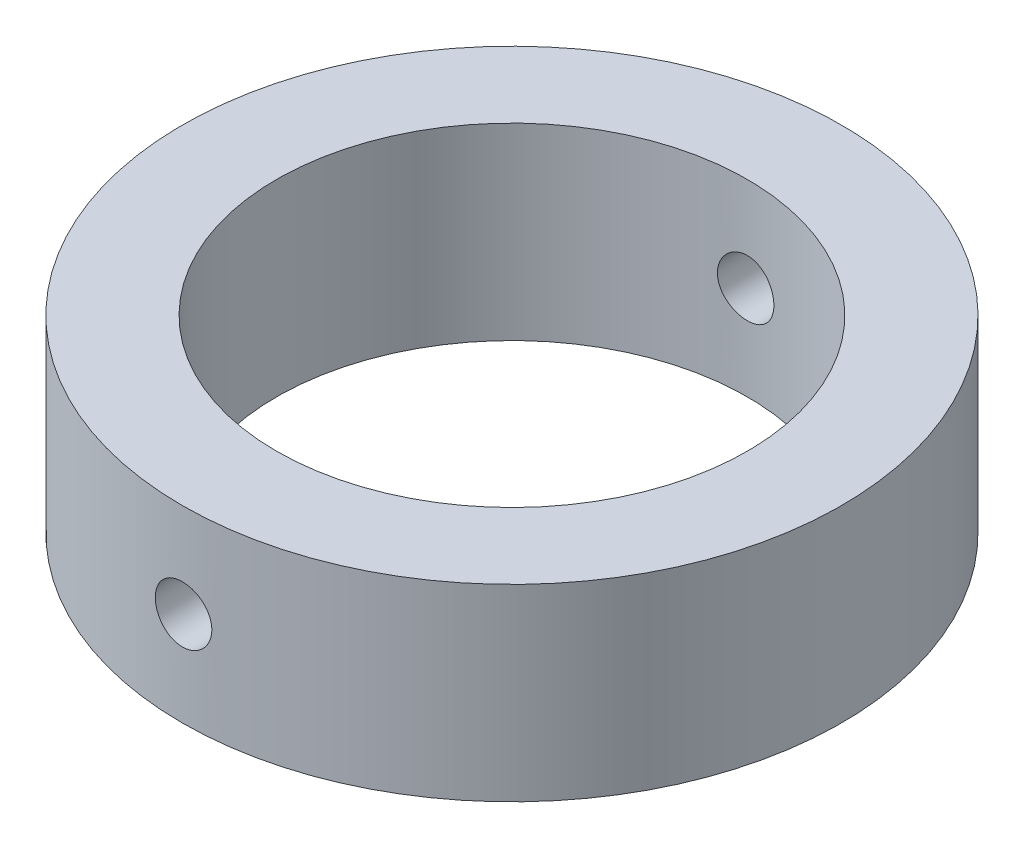
ISO-10303-21;
HEADER;
FILE_DESCRIPTION(('STEP AP214'),'2;1');
FILE_NAME('part.step','',(''),(''),'','','');
FILE_SCHEMA(('AUTOMOTIVE_DESIGN { 1 0 10303 214 1 1 1 1 }'));
ENDSEC;
DATA;
#1=APPLICATION_CONTEXT('core data for automotive mechanical design processes');
#2=APPLICATION_PROTOCOL_DEFINITION('international standard','automotive_design',2000,#1);
#3=PRODUCT_CONTEXT('',#1,'mechanical');
#4=PRODUCT('Part','Part','',(#3));
#5=PRODUCT_RELATED_PRODUCT_CATEGORY('part','',(#4));
#6=PRODUCT_DEFINITION_FORMATION('','',#4);
#7=PRODUCT_DEFINITION_CONTEXT('part definition',#1,'design');
#8=PRODUCT_DEFINITION('design','',#6,#7);
#9=PRODUCT_DEFINITION_SHAPE('','',#8);
#10=(LENGTH_UNIT() NAMED_UNIT(*) SI_UNIT(.MILLI.,.METRE.));
#11=(NAMED_UNIT(*) PLANE_ANGLE_UNIT() SI_UNIT($,.RADIAN.));
#12=(NAMED_UNIT(*) SI_UNIT($,.STERADIAN.) SOLID_ANGLE_UNIT());
#13=UNCERTAINTY_MEASURE_WITH_UNIT(LENGTH_MEASURE(1.E-05),#10,'distance_accuracy_value','');
#14=(GEOMETRIC_REPRESENTATION_CONTEXT(3) GLOBAL_UNCERTAINTY_ASSIGNED_CONTEXT((#13)) GLOBAL_UNIT_ASSIGNED_CONTEXT((#10,
#11,#12)) REPRESENTATION_CONTEXT('',''));
#15=CARTESIAN_POINT('',(0.,0.,0.));
#16=DIRECTION('',(0.,0.,1.));
#17=DIRECTION('',(1.,0.,0.));
#18=AXIS2_PLACEMENT_3D('',#15,#16,#17);
#19=CARTESIAN_POINT('',(0.,20.,0.));
#20=DIRECTION('',(0.,1.,0.));
#21=DIRECTION('',(0.,0.,1.));
#22=AXIS2_PLACEMENT_3D('',#19,#20,#21);
#23=PLANE('',#22);
#24=CARTESIAN_POINT('',(0.,20.,0.));
#25=DIRECTION('',(0.,1.,0.));
#26=DIRECTION('',(0.,0.,1.));
#27=AXIS2_PLACEMENT_3D('',#24,#25,#26);
#28=CIRCLE('',#27,35.);
#29=CARTESIAN_POINT('',(0.,20.,35.));
#30=VERTEX_POINT('',#29);
#31=EDGE_CURVE('E10',#30,#30,#28,.T.);
#32=ORIENTED_EDGE('',*,*,#31,.T.);
#33=EDGE_LOOP('',(#32));
#34=FACE_BOUND('',#33,.T.);
#35=CARTESIAN_POINT('',(0.,20.,0.));
#36=DIRECTION('',(0.,1.,0.));
#37=DIRECTION('',(0.,0.,1.));
#38=AXIS2_PLACEMENT_3D('',#35,#36,#37);
#39=CIRCLE('',#38,25.);
#40=CARTESIAN_POINT('',(0.,20.,25.));
#41=VERTEX_POINT('',#40);
#42=EDGE_CURVE('E56',#41,#41,#39,.T.);
#43=ORIENTED_EDGE('',*,*,#42,.F.);
#44=EDGE_LOOP('',(#43));
#45=FACE_BOUND('',#44,.T.);
#46=ADVANCED_FACE('F37',(#34,#45),#23,.T.);
#47=CARTESIAN_POINT('',(0.,0.,0.));
#48=DIRECTION('',(0.,1.,0.));
#49=DIRECTION('',(0.,0.,1.));
#50=AXIS2_PLACEMENT_3D('',#47,#48,#49);
#51=PLANE('',#50);
#52=CARTESIAN_POINT('',(0.,0.,0.));
#53=DIRECTION('',(0.,1.,0.));
#54=DIRECTION('',(0.,0.,1.));
#55=AXIS2_PLACEMENT_3D('',#52,#53,#54);
#56=CIRCLE('',#55,35.);
#57=CARTESIAN_POINT('',(0.,0.,35.));
#58=VERTEX_POINT('',#57);
#59=EDGE_CURVE('E51',#58,#58,#56,.T.);
#60=ORIENTED_EDGE('',*,*,#59,.F.);
#61=EDGE_LOOP('',(#60));
#62=FACE_BOUND('',#61,.T.);
#63=CARTESIAN_POINT('',(0.,0.,0.));
#64=DIRECTION('',(0.,1.,0.));
#65=DIRECTION('',(0.,0.,1.));
#66=AXIS2_PLACEMENT_3D('',#63,#64,#65);
#67=CIRCLE('',#66,25.);
#68=CARTESIAN_POINT('',(0.,0.,25.));
#69=VERTEX_POINT('',#68);
#70=EDGE_CURVE('E59',#69,#69,#67,.T.);
#71=ORIENTED_EDGE('',*,*,#70,.T.);
#72=EDGE_LOOP('',(#71));
#73=FACE_BOUND('',#72,.T.);
#74=ADVANCED_FACE('F95',(#62,#73),#51,.F.);
#75=CARTESIAN_POINT('',(0.,20.,0.));
#76=DIRECTION('',(0.,-1.,0.));
#77=DIRECTION('',(0.,0.,-1.));
#78=AXIS2_PLACEMENT_3D('',#75,#76,#77);
#79=CYLINDRICAL_SURFACE('',#78,35.);
#80=CARTESIAN_POINT('',(0.,13.,-35.));
#81=CARTESIAN_POINT('',(-0.168180177421425,12.9999926621086,-34.9999983189466));
#82=CARTESIAN_POINT('',(-0.336474410694065,12.9858101377132,-34.9987748870089));
#83=CARTESIAN_POINT('',(-0.668405276387218,12.9294427662291,-34.9940120055983));
#84=CARTESIAN_POINT('',(-0.832036433522409,12.8872263096079,-34.9904699418268));
#85=CARTESIAN_POINT('',(-1.14978580604665,12.7760219308489,-34.9814700099417));
#86=CARTESIAN_POINT('',(-1.30390939390644,12.7070492915307,-34.9760132356579));
#87=CARTESIAN_POINT('',(-1.5983553572425,12.5443180840418,-34.9637955952331));
#88=CARTESIAN_POINT('',(-1.7386806487592,12.4505647683675,-34.9570350055299));
#89=CARTESIAN_POINT('',(-2.00196024172095,12.2406617110507,-34.9429478698077));
#90=CARTESIAN_POINT('',(-2.12487233650439,12.1244591132005,-34.9356200130702));
#91=CARTESIAN_POINT('',(-2.34947428548936,11.8730679106441,-34.9212352148941));
#92=CARTESIAN_POINT('',(-2.45116320107853,11.7378784666713,-34.9141782854488));
#93=CARTESIAN_POINT('',(-2.63057608789142,11.4520942390574,-34.9011203668809));
#94=CARTESIAN_POINT('',(-2.70826279885841,11.3014759820008,-34.895121025662));
#95=CARTESIAN_POINT('',(-2.83722803822897,10.9892731041776,-34.8848727505605));
#96=CARTESIAN_POINT('',(-2.88850705745045,10.8276886872931,-34.8806237841455));
#97=CARTESIAN_POINT('',(-2.96307845769353,10.4985643557107,-34.8743684880487));
#98=CARTESIAN_POINT('',(-2.98643979537529,10.3310401716124,-34.8723566335604));
#99=CARTESIAN_POINT('',(-3.00472573441206,9.99443731566983,-34.8707859372111));
#100=CARTESIAN_POINT('',(-2.99965089755265,9.82535867460139,-34.8712270468893));
#101=CARTESIAN_POINT('',(-2.96126551313284,9.49091935009246,-34.874507414771));
#102=CARTESIAN_POINT('',(-2.92802995365881,9.32554998866099,-34.8773403039272));
#103=CARTESIAN_POINT('',(-2.83438308452453,9.00274549875546,-34.8850750500347));
#104=CARTESIAN_POINT('',(-2.77397149596723,8.84531045172664,-34.8899769282191));
#105=CARTESIAN_POINT('',(-2.62760362876988,8.5426048976093,-34.9013046627491));
#106=CARTESIAN_POINT('',(-2.54161375570937,8.39735071245932,-34.9077325210554));
#107=CARTESIAN_POINT('',(-2.34655446417304,8.12330862382476,-34.9213861292491));
#108=CARTESIAN_POINT('',(-2.23748455081154,7.99452107351525,-34.9286118962437));
#109=CARTESIAN_POINT('',(-1.99894091774494,7.75663207823613,-34.9430754969892));
#110=CARTESIAN_POINT('',(-1.86940237855328,7.64759561833133,-34.9503132942366));
#111=CARTESIAN_POINT('',(-1.59382461581758,7.45280656292255,-34.9639632077666));
#112=CARTESIAN_POINT('',(-1.44778538038973,7.36705398418778,-34.9703753234546));
#113=CARTESIAN_POINT('',(-1.14330913680171,7.2212707481009,-34.9816527329005));
#114=CARTESIAN_POINT('',(-0.984870717201057,7.16124302414623,-34.9865178502383));
#115=CARTESIAN_POINT('',(-0.660113221128349,7.06865924334512,-34.9941511080319));
#116=CARTESIAN_POINT('',(-0.493794317781496,7.03610258328611,-34.9969192945321));
#117=CARTESIAN_POINT('',(-0.158560250833971,6.99946669791016,-35.0000408811528));
#118=CARTESIAN_POINT('',(0.0103450366761299,6.99529772286168,-35.0004018916599));
#119=CARTESIAN_POINT('',(0.346452104482659,7.01532035576532,-34.9986887867208));
#120=CARTESIAN_POINT('',(0.513653901587615,7.03951168360929,-34.9966146953254));
#121=CARTESIAN_POINT('',(0.841351421558966,7.11549382233641,-34.9902695086844));
#122=CARTESIAN_POINT('',(1.00185687270474,7.16724297716301,-34.9860017297263));
#123=CARTESIAN_POINT('',(1.31190702245475,7.29682922006561,-34.9757485102754));
#124=CARTESIAN_POINT('',(1.46145153801856,7.37466674367936,-34.9697630411066));
#125=CARTESIAN_POINT('',(1.7457428816744,7.55444535294469,-34.9567262474856));
#126=CARTESIAN_POINT('',(1.88045202960912,7.65644583152676,-34.9496723123826));
#127=CARTESIAN_POINT('',(2.13086824169311,7.88156921992449,-34.9352996751561));
#128=CARTESIAN_POINT('',(2.24657495644839,8.00469251803617,-34.9279809681673));
#129=CARTESIAN_POINT('',(2.45601016602155,8.26895626973909,-34.9138810732733));
#130=CARTESIAN_POINT('',(2.54968004901865,8.41014326356234,-34.9071013498897));
#131=CARTESIAN_POINT('',(2.71198063229128,8.70629524502194,-34.8948680127784));
#132=CARTESIAN_POINT('',(2.78061159495576,8.8612600882557,-34.8894143851545));
#133=CARTESIAN_POINT('',(2.8907865424564,9.18036221112401,-34.8804590783594));
#134=CARTESIAN_POINT('',(2.93236627395852,9.34448707344406,-34.8769548240937));
#135=CARTESIAN_POINT('',(2.98737479633476,9.67742005737787,-34.872286503041));
#136=CARTESIAN_POINT('',(3.0008041627162,9.84622808317732,-34.871122388412));
#137=CARTESIAN_POINT('',(2.99912392353084,10.1831530647903,-34.8712668950776));
#138=CARTESIAN_POINT('',(2.98410640669543,10.3512704909289,-34.8725675374249));
#139=CARTESIAN_POINT('',(2.92615085557176,10.6825859274482,-34.8774780477604));
#140=CARTESIAN_POINT('',(2.88321277999482,10.8457839305537,-34.8810879191635));
#141=CARTESIAN_POINT('',(2.7706585792072,11.1626330215739,-34.8902080316544));
#142=CARTESIAN_POINT('',(2.70104425727074,11.3162847539864,-34.8957181442861));
#143=CARTESIAN_POINT('',(2.53712384137618,11.6097355757974,-34.9080181097009));
#144=CARTESIAN_POINT('',(2.4428181018962,11.7495348640265,-34.9148079441114));
#145=CARTESIAN_POINT('',(2.23184571903132,12.0117838459397,-34.9289284828144));
#146=CARTESIAN_POINT('',(2.11511080731054,12.1341785330169,-34.9362607952504));
#147=CARTESIAN_POINT('',(1.86271960746937,12.357688026767,-34.9506254222313));
#148=CARTESIAN_POINT('',(1.72705875414518,12.4587976843829,-34.9576576638589));
#149=CARTESIAN_POINT('',(1.44039065385252,12.6370108284413,-34.9706432183249));
#150=CARTESIAN_POINT('',(1.28935405311577,12.7140672103455,-34.9765944046818));
#151=CARTESIAN_POINT('',(0.976537475486436,12.8416267776672,-34.9867226680456));
#152=CARTESIAN_POINT('',(0.814770058056751,12.8921604088507,-34.9909017781752));
#153=CARTESIAN_POINT('',(0.543377751492647,12.9524054943071,-34.9959451685553));
#154=CARTESIAN_POINT('',(0.4354969109927,12.9702296244532,-34.9974587860022));
#155=CARTESIAN_POINT('',(0.218426750644092,12.9940292435666,-34.9994867462511));
#156=CARTESIAN_POINT('',(0.109237434508938,13.0000047661528,-35.0000010918883));
#157=CARTESIAN_POINT('',(0.,13.,-35.));
#158=B_SPLINE_CURVE_WITH_KNOTS('',3,(#80,#81,#82,#83,#84,#85,#86,#87,#88,#89,#90,#91,#92,#93,
#94,#95,#96,#97,#98,#99,#100,#101,#102,#103,#104,#105,#106,#107,#108,#109,#110,#111,#112,#113,
#114,#115,#116,#117,#118,#119,#120,#121,#122,#123,#124,#125,#126,#127,#128,#129,#130,#131,#132,
#133,#134,#135,#136,#137,#138,#139,#140,#141,#142,#143,#144,#145,#146,#147,#148,#149,#150,#151,
#152,#153,#154,#155,#156,#157),.UNSPECIFIED.,.T.,.F.,(4,2,2,2,2,2,2,2,2,2,2,2,2,2,2,2,2,2,2,2,2,
2,2,2,2,2,2,2,2,2,2,2,2,2,2,2,2,2,4),(0.,0.504141688620748,1.0088527873041,1.51327602436422,
2.01759242981481,2.5231110330061,3.0286519884333,3.53497383147415,4.04128626359052,
4.54634550220951,5.05139476290399,5.55510335902216,6.05881712462464,6.56319540924795,
7.06758450992202,7.57360414720597,8.07962414892789,8.58570183661506,9.09176841150507,
9.59623427417642,10.1006951543972,10.6043956535469,11.1081045622491,11.6130646830275,
12.1180340873686,12.6243317573245,13.1306241215114,13.636246082805,14.1418577070399,
14.6458353534655,15.1498137451707,15.6537580747011,16.1576951698375,16.6631911333163,
17.1688092410494,17.6754113983993,18.1814307424438,18.5088849156758,18.8363381597995),.UNSPECIFIED.);
#159=CARTESIAN_POINT('',(0.,13.,-35.));
#160=VERTEX_POINT('',#159);
#161=EDGE_CURVE('E84',#160,#160,#158,.T.);
#162=ORIENTED_EDGE('',*,*,#161,.T.);
#163=EDGE_LOOP('',(#162));
#164=FACE_BOUND('',#163,.T.);
#165=CARTESIAN_POINT('',(3.,10.,34.8711915483254));
#166=CARTESIAN_POINT('',(2.99999266095691,9.83182110220312,34.8711932525099));
#167=CARTESIAN_POINT('',(2.98581034508464,9.6635281444135,34.8724213033618));
#168=CARTESIAN_POINT('',(2.92944387718635,9.33159992889202,34.8772006862277));
#169=CARTESIAN_POINT('',(2.88722811123404,9.16797014744623,34.8807546411484));
#170=CARTESIAN_POINT('',(2.77602575299661,8.85022368351939,34.8897803696251));
#171=CARTESIAN_POINT('',(2.70705447640826,8.69610161691769,34.8952510458163));
#172=CARTESIAN_POINT('',(2.54432647781201,8.40165820131932,34.9074924396004));
#173=CARTESIAN_POINT('',(2.45057500494258,8.2613339381889,34.9142628817837));
#174=CARTESIAN_POINT('',(2.24067380704696,7.99805317899114,34.9283615283204));
#175=CARTESIAN_POINT('',(2.12447081430967,7.87513921650707,34.9356910335478));
#176=CARTESIAN_POINT('',(1.87307803845591,7.65053366426425,34.9500700569052));
#177=CARTESIAN_POINT('',(1.73788742116142,7.54884300739128,34.9571195627167));
#178=CARTESIAN_POINT('',(1.45210217047511,7.36942830362212,34.9701567059702));
#179=CARTESIAN_POINT('',(1.3014842653979,7.29174119609241,34.9761427008053));
#180=CARTESIAN_POINT('',(0.989282152733707,7.16277512639066,34.9863643242021));
#181=CARTESIAN_POINT('',(0.827698147061467,7.11149567813343,34.9905999849818));
#182=CARTESIAN_POINT('',(0.49857505421878,7.03692337559085,34.9968345988916));
#183=CARTESIAN_POINT('',(0.331051705301398,7.01356152909634,34.9988390650836));
#184=CARTESIAN_POINT('',(-0.00554951687182026,6.99527428308786,35.0004041331516));
#185=CARTESIAN_POINT('',(-0.174627359650711,7.00034832725016,34.9999647828389));
#186=CARTESIAN_POINT('',(-0.509070191841329,7.03873246102892,34.9966962646731));
#187=CARTESIAN_POINT('',(-0.674443766007425,7.07196836038356,34.9938733761383));
#188=CARTESIAN_POINT('',(-0.997256506055931,7.16561737123898,34.9861624784117));
#189=CARTESIAN_POINT('',(-1.154695592729,7.22603075399063,34.9812744486083));
#190=CARTESIAN_POINT('',(-1.45740602670417,7.37240232714897,34.9699723253966));
#191=CARTESIAN_POINT('',(-1.6026612561083,7.45839369186082,34.9635562523037));
#192=CARTESIAN_POINT('',(-1.87670479976716,7.6534561621967,34.9499189285463));
#193=CARTESIAN_POINT('',(-2.0054927602542,7.76252776352178,34.9426976605898));
#194=CARTESIAN_POINT('',(-2.24337983249144,8.00107258841206,34.9282339351113));
#195=CARTESIAN_POINT('',(-2.35241430046894,8.13061028823158,34.9209914841214));
#196=CARTESIAN_POINT('',(-2.54719973764136,8.40618566384501,34.9073249949716));
#197=CARTESIAN_POINT('',(-2.63295068598784,8.55222335441313,34.9009009575446));
#198=CARTESIAN_POINT('',(-2.77873275129373,8.85669919114177,34.8895975532274));
#199=CARTESIAN_POINT('',(-2.83876042932541,9.01513899198607,34.8847183928937));
#200=CARTESIAN_POINT('',(-2.93134369450066,9.33989948862507,34.8770612464214));
#201=CARTESIAN_POINT('',(-2.96389989316699,9.50622000890571,34.8742832135113));
#202=CARTESIAN_POINT('',(-3.00053403997774,9.84145480950811,34.8711505281844));
#203=CARTESIAN_POINT('',(-3.00470217287089,10.0103591658262,34.8707882014983));
#204=CARTESIAN_POINT('',(-2.98467818807446,10.3464641685157,34.872507698123));
#205=CARTESIAN_POINT('',(-2.96048635048195,10.5136648316971,34.8745894972945));
#206=CARTESIAN_POINT('',(-2.88450436177439,10.8413568051811,34.8809556846261));
#207=CARTESIAN_POINT('',(-2.8327563709266,11.0018579621147,34.8852367076732));
#208=CARTESIAN_POINT('',(-2.70317389532559,11.3119000388947,34.8955161982866));
#209=CARTESIAN_POINT('',(-2.62533896819065,11.461440772822,34.9015146949777));
#210=CARTESIAN_POINT('',(-2.44556416469073,11.7457295680083,34.914571856145));
#211=CARTESIAN_POINT('',(-2.34356423538402,11.8804395313929,34.9216331455838));
#212=CARTESIAN_POINT('',(-2.11844147546403,12.1308576448824,34.9360114257588));
#213=CARTESIAN_POINT('',(-1.99531826047652,12.2465654491355,34.9433284211461));
#214=CARTESIAN_POINT('',(-1.7310540273121,12.4560029728843,34.9574165642762));
#215=CARTESIAN_POINT('',(-1.58986645530174,12.549674065437,34.9641862252016));
#216=CARTESIAN_POINT('',(-1.2937129987535,12.7119767717214,34.9763954820041));
#217=CARTESIAN_POINT('',(-1.1387472587636,12.7806086481032,34.9818350918327));
#218=CARTESIAN_POINT('',(-0.819645734517392,12.8907842087084,34.9907645239193));
#219=CARTESIAN_POINT('',(-0.655522504793544,12.932364035361,34.9942569467868));
#220=CARTESIAN_POINT('',(-0.322592960793772,12.9873733013822,34.998909077746));
#221=CARTESIAN_POINT('',(-0.153786740881575,13.0008033075618,35.000068832807));
#222=CARTESIAN_POINT('',(0.183139370810557,12.9991249178628,34.9999250150549));
#223=CARTESIAN_POINT('',(0.351259728396027,12.9841078420171,34.9986293246391));
#224=CARTESIAN_POINT('',(0.682581136937832,12.9261521408573,34.9937357808951));
#225=CARTESIAN_POINT('',(0.845782181536318,12.8832134794582,34.9901379245917));
#226=CARTESIAN_POINT('',(1.16263730873111,12.7706569781232,34.9810436514562));
#227=CARTESIAN_POINT('',(1.31629202900732,12.701040922428,34.9755473615978));
#228=CARTESIAN_POINT('',(1.60974810184892,12.5371161153677,34.9632708237673));
#229=CARTESIAN_POINT('',(1.74954965509232,12.4428077217697,34.9564905943986));
#230=CARTESIAN_POINT('',(2.01179846018098,12.2318324384591,34.9423810754166));
#231=CARTESIAN_POINT('',(2.13419119122391,12.1150978861273,34.9350501661676));
#232=CARTESIAN_POINT('',(2.35769690654864,11.8627082072799,34.9206793149367));
#233=CARTESIAN_POINT('',(2.45880473667584,11.7270485112192,34.9136394437606));
#234=CARTESIAN_POINT('',(2.63701593547982,11.4403813349937,34.9006328206687));
#235=CARTESIAN_POINT('',(2.71407186567635,11.2893442935208,34.8946681991704));
#236=CARTESIAN_POINT('',(2.84163046603466,10.9765267772395,34.8845133075443));
#237=CARTESIAN_POINT('',(2.89216358839389,10.8147588646337,34.8803210036088));
#238=CARTESIAN_POINT('',(2.95240722581038,10.5433679219208,34.8752608485375));
#239=CARTESIAN_POINT('',(2.97023070444527,10.4354890428811,34.8737419022807));
#240=CARTESIAN_POINT('',(2.9940294579401,10.218422813093,34.871706700165));
#241=CARTESIAN_POINT('',(3.00000476685127,10.109235466106,34.8711904414244));
#242=CARTESIAN_POINT('',(3.,10.,34.8711915483254));
#243=B_SPLINE_CURVE_WITH_KNOTS('',3,(#165,#166,#167,#168,#169,#170,#171,#172,#173,#174,#175,
#176,#177,#178,#179,#180,#181,#182,#183,#184,#185,#186,#187,#188,#189,#190,#191,#192,#193,#194,
#195,#196,#197,#198,#199,#200,#201,#202,#203,#204,#205,#206,#207,#208,#209,#210,#211,#212,#213,
#214,#215,#216,#217,#218,#219,#220,#221,#222,#223,#224,#225,#226,#227,#228,#229,#230,#231,#232,
#233,#234,#235,#236,#237,#238,#239,#240,#241,#242),.UNSPECIFIED.,.T.,.F.,(4,2,2,2,2,2,2,2,2,2,2,
2,2,2,2,2,2,2,2,2,2,2,2,2,2,2,2,2,2,2,2,2,2,2,2,2,2,2,4),(0.,0.504137845154904,1.0088451851254,
1.51326404003696,2.01757613044269,2.52309976273197,3.0286456110007,3.53496561920689,
4.04127630725863,4.54633315507159,5.0513801219166,5.55510070289603,6.05882631148133,
6.56320811562686,7.06760075362891,7.57361533214636,8.07963036375613,8.58571302310648,
9.09178441661877,9.5962473420388,10.1007052851759,10.6043936277359,11.1080905122643,
11.6130525231886,12.1180237237333,12.6243235404852,13.1306180462274,13.6362347291713,
14.1418412311696,14.6458273992463,15.1498142186598,15.6537673362459,16.1577131524622,
16.6632040203355,17.1688171527569,17.6754213142688,18.1814425380561,18.5088908177617,
18.836338156391),.UNSPECIFIED.);
#244=CARTESIAN_POINT('',(3.,10.,34.8711915483254));
#245=VERTEX_POINT('',#244);
#246=EDGE_CURVE('E79',#245,#245,#243,.T.);
#247=ORIENTED_EDGE('',*,*,#246,.T.);
#248=EDGE_LOOP('',(#247));
#249=FACE_BOUND('',#248,.T.);
#250=ORIENTED_EDGE('',*,*,#31,.F.);
#251=EDGE_LOOP('',(#250));
#252=FACE_BOUND('',#251,.T.);
#253=ORIENTED_EDGE('',*,*,#59,.T.);
#254=EDGE_LOOP('',(#253));
#255=FACE_BOUND('',#254,.T.);
#256=ADVANCED_FACE('F39',(#164,#249,#252,#255),#79,.T.);
#257=CARTESIAN_POINT('',(0.,20.,0.));
#258=DIRECTION('',(0.,-1.,0.));
#259=DIRECTION('',(0.,0.,-1.));
#260=AXIS2_PLACEMENT_3D('',#257,#258,#259);
#261=CYLINDRICAL_SURFACE('',#260,25.);
#262=CARTESIAN_POINT('',(0.,13.,-25.));
#263=CARTESIAN_POINT('',(-0.167864047107699,12.9999928360586,-24.9999977357459));
#264=CARTESIAN_POINT('',(-0.335834317331191,12.9858633413073,-24.9982914200408));
#265=CARTESIAN_POINT('',(-0.66710457130825,12.9297189358446,-24.991648705422));
#266=CARTESIAN_POINT('',(-0.830399429590069,12.8876745587494,-24.9867088933728));
#267=CARTESIAN_POINT('',(-1.14747479534053,12.776953723474,-24.9741559265426));
#268=CARTESIAN_POINT('',(-1.30126148759225,12.7082947931758,-24.9665445315309));
#269=CARTESIAN_POINT('',(-1.595099157832,12.5463312649167,-24.9494959264345));
#270=CARTESIAN_POINT('',(-1.73515256713516,12.4530310402467,-24.9400590404141));
#271=CARTESIAN_POINT('',(-1.99829131534451,12.2439251380248,-24.920360105442));
#272=CARTESIAN_POINT('',(-2.1212966913072,12.1280191598881,-24.9100945030904));
#273=CARTESIAN_POINT('',(-2.34615931038342,11.8772070351121,-24.8899239397152));
#274=CARTESIAN_POINT('',(-2.44801549826474,11.7422999409814,-24.8800189967068));
#275=CARTESIAN_POINT('',(-2.62798342873896,11.4567991747016,-24.8616560370405));
#276=CARTESIAN_POINT('',(-2.7060207567257,11.3061582754199,-24.8532025903971));
#277=CARTESIAN_POINT('',(-2.8356605730156,10.9937912978913,-24.8387461344686));
#278=CARTESIAN_POINT('',(-2.88726398696776,10.8320656080307,-24.8327430393798));
#279=CARTESIAN_POINT('',(-2.96232930045399,10.5029471406886,-24.8239006073737));
#280=CARTESIAN_POINT('',(-2.98592577987646,10.3355854715723,-24.8210461452543));
#281=CARTESIAN_POINT('',(-3.0047237521967,9.99925506363583,-24.8187777690611));
#282=CARTESIAN_POINT('',(-2.99992630052848,9.83028638478303,-24.8193637271033));
#283=CARTESIAN_POINT('',(-2.96218316078668,9.49647403521565,-24.8238961466306));
#284=CARTESIAN_POINT('',(-2.92938543222303,9.33161336131982,-24.8278249434675));
#285=CARTESIAN_POINT('',(-2.83680346170067,9.00975297217864,-24.8385728087608));
#286=CARTESIAN_POINT('',(-2.77701871225814,8.85275340482101,-24.8453919315688));
#287=CARTESIAN_POINT('',(-2.63199980699862,8.55061053176089,-24.8611722079476));
#288=CARTESIAN_POINT('',(-2.54670106203925,8.40549852164644,-24.8701387862198));
#289=CARTESIAN_POINT('',(-2.35312173169469,8.13159278908424,-24.8891993987901));
#290=CARTESIAN_POINT('',(-2.24484017723156,8.00279975509743,-24.8992934806213));
#291=CARTESIAN_POINT('',(-2.0075475556218,7.76432891563562,-24.9195503308637));
#292=CARTESIAN_POINT('',(-1.87840890051216,7.65477803014294,-24.929713127424));
#293=CARTESIAN_POINT('',(-1.60350795893872,7.45888847899969,-24.9489020798549));
#294=CARTESIAN_POINT('',(-1.45774563908005,7.37254985998085,-24.9579282334421));
#295=CARTESIAN_POINT('',(-1.15363930826285,7.22553671436034,-24.9738318861702));
#296=CARTESIAN_POINT('',(-0.995291578715591,7.16486980666956,-24.9807087472809));
#297=CARTESIAN_POINT('',(-0.670556022273439,7.0710212621491,-24.991533065309));
#298=CARTESIAN_POINT('',(-0.504168542441623,7.03783843999552,-24.9954806485584));
#299=CARTESIAN_POINT('',(-0.169174396374216,7.00006374450231,-24.9999852500304));
#300=CARTESIAN_POINT('',(-0.000587720432051065,6.9952969675993,-25.0005630093753));
#301=CARTESIAN_POINT('',(0.334982068243261,7.01402857786827,-24.9983187823231));
#302=CARTESIAN_POINT('',(0.501965212327329,7.03752641129535,-24.9954968625308));
#303=CARTESIAN_POINT('',(0.829074263928357,7.11197496400309,-24.9867833380686));
#304=CARTESIAN_POINT('',(0.989219346369035,7.16284261305008,-24.9809010237909));
#305=CARTESIAN_POINT('',(1.29870539768646,7.29050070335358,-24.9667255501792));
#306=CARTESIAN_POINT('',(1.44804602592347,7.36729196149009,-24.9584323148759));
#307=CARTESIAN_POINT('',(1.73246717766504,7.54504291590243,-24.9403085158695));
#308=CARTESIAN_POINT('',(1.86747628962751,7.64611613781082,-24.9304708084643));
#309=CARTESIAN_POINT('',(2.11867625152203,7.86940084640817,-24.9103817919419));
#310=CARTESIAN_POINT('',(2.23486641472949,7.99161310414795,-24.9001304677484));
#311=CARTESIAN_POINT('',(2.44574795226154,8.25447561542769,-24.8803059484942));
#312=CARTESIAN_POINT('',(2.54032363231939,8.39521901534385,-24.8707365831307));
#313=CARTESIAN_POINT('',(2.70449314429332,8.69069502507556,-24.8534214993383));
#314=CARTESIAN_POINT('',(2.77408744356074,8.84542737311824,-24.8456757467943));
#315=CARTESIAN_POINT('',(2.88612996668159,9.1641106088947,-24.8329105734502));
#316=CARTESIAN_POINT('',(2.92864420159346,9.32803801185939,-24.8278845275633));
#317=CARTESIAN_POINT('',(2.98553272163516,9.66076896948507,-24.8211085274587));
#318=CARTESIAN_POINT('',(2.99990820526081,9.82957231615733,-24.8193584337106));
#319=CARTESIAN_POINT('',(3.00009033817931,10.1661127296372,-24.819336326607));
#320=CARTESIAN_POINT('',(2.98607873671351,10.3338497257713,-24.8210421863943));
#321=CARTESIAN_POINT('',(2.93026848672089,10.6645667863942,-24.8276922947425));
#322=CARTESIAN_POINT('',(2.88846982822067,10.8275468491756,-24.8326365444656));
#323=CARTESIAN_POINT('',(2.77832739820545,11.1441045388887,-24.8451996524586));
#324=CARTESIAN_POINT('',(2.70999165570539,11.2976849934955,-24.8528177016812));
#325=CARTESIAN_POINT('',(2.5487328262801,11.5912277470701,-24.8698714539139));
#326=CARTESIAN_POINT('',(2.45580952709445,11.7311899284593,-24.8793071726153));
#327=CARTESIAN_POINT('',(2.24733689647205,11.9944529401088,-24.8990055122588));
#328=CARTESIAN_POINT('',(2.1316520393015,12.1176461032663,-24.9092728581347));
#329=CARTESIAN_POINT('',(1.88122093334447,12.342942479566,-24.9294354968169));
#330=CARTESIAN_POINT('',(1.74647018263601,12.4450406976292,-24.939330701051));
#331=CARTESIAN_POINT('',(1.46119322465137,12.6255505779989,-24.9576721709324));
#332=CARTESIAN_POINT('',(1.31061323462417,12.7038777257223,-24.966113221621));
#333=CARTESIAN_POINT('',(0.99842275168531,12.8340237644426,-24.9805418519727));
#334=CARTESIAN_POINT('',(0.836824564362143,12.8858716961804,-24.9865321180615));
#335=CARTESIAN_POINT('',(0.561977101236695,12.9490634203381,-24.9939268325999));
#336=CARTESIAN_POINT('',(0.450466569753485,12.9681374838864,-24.996193279433));
#337=CARTESIAN_POINT('',(0.225986735693693,12.993608143491,-24.9992306204204));
#338=CARTESIAN_POINT('',(0.113017442753625,13.0000048232505,-25.0000015244492));
#339=CARTESIAN_POINT('',(0.,13.,-25.));
#340=B_SPLINE_CURVE_WITH_KNOTS('',3,(#262,#263,#264,#265,#266,#267,#268,#269,#270,#271,#272,
#273,#274,#275,#276,#277,#278,#279,#280,#281,#282,#283,#284,#285,#286,#287,#288,#289,#290,#291,
#292,#293,#294,#295,#296,#297,#298,#299,#300,#301,#302,#303,#304,#305,#306,#307,#308,#309,#310,
#311,#312,#313,#314,#315,#316,#317,#318,#319,#320,#321,#322,#323,#324,#325,#326,#327,#328,#329,
#330,#331,#332,#333,#334,#335,#336,#337,#338,#339),.UNSPECIFIED.,.T.,.F.,(4,2,2,2,2,2,2,2,2,2,2,
2,2,2,2,2,2,2,2,2,2,2,2,2,2,2,2,2,2,2,2,2,2,2,2,2,2,2,4),(0.,0.503179350956159,1.00689069408623,
1.5102708637556,2.01356175441693,2.51913872195878,3.02474090904883,3.53190689496397,
4.03905511999114,4.54375638343279,5.0484388866848,5.55047092912253,6.05251241253396,
6.55583573710536,7.05918028869262,7.56572944640317,8.07227962172601,8.57898002694278,
9.08565857822619,9.58921522624226,10.0927620090108,10.5947890255775,11.0968318630167,
11.6012692178556,12.1057249760356,12.6128207581672,13.119907053063,13.6257524826489,
14.1315763666154,14.6341719319229,15.1367676776234,15.6392114771388,16.1416596143122,
16.6471952402032,17.1528504352009,17.6602829023946,18.1671576479275,18.5059342945627,
18.8447087043981),.UNSPECIFIED.);
#341=CARTESIAN_POINT('',(0.,13.,-25.));
#342=VERTEX_POINT('',#341);
#343=EDGE_CURVE('E42',#342,#342,#340,.T.);
#344=ORIENTED_EDGE('',*,*,#343,.F.);
#345=EDGE_LOOP('',(#344));
#346=FACE_BOUND('',#345,.T.);
#347=CARTESIAN_POINT('',(3.,10.,24.8193472919817));
#348=CARTESIAN_POINT('',(2.99999283172714,9.83214085880013,24.819349617552));
#349=CARTESIAN_POINT('',(2.98586413495824,9.66417547985016,24.8210685774632));
#350=CARTESIAN_POINT('',(2.92972318709126,9.33291538794212,24.8277564496116));
#351=CARTESIAN_POINT('',(2.88768145238964,9.16962580431374,24.8327287982131));
#352=CARTESIAN_POINT('',(2.77696834616031,8.85256159449547,24.8453523109071));
#353=CARTESIAN_POINT('',(2.708314627898,8.69878073886627,24.8530016988387));
#354=CARTESIAN_POINT('',(2.5463633755789,8.40495285789654,24.8701152498661));
#355=CARTESIAN_POINT('',(2.45307020212001,8.26490340843137,24.8795790917656));
#356=CARTESIAN_POINT('',(2.24397143930053,8.0017602283905,24.8993100054925));
#357=CARTESIAN_POINT('',(2.1280639725065,7.87874770565158,24.9095805816582));
#358=CARTESIAN_POINT('',(1.87724586434875,7.65387128183791,24.9297361585383));
#359=CARTESIAN_POINT('',(1.74233429505413,7.55200841405816,24.9396211403948));
#360=CARTESIAN_POINT('',(1.45682956846799,7.37203346706378,24.9579274023082));
#361=CARTESIAN_POINT('',(1.30618995384899,7.29399458426038,24.9663441380671));
#362=CARTESIAN_POINT('',(0.993825767272774,7.16435153961525,24.9807271243236));
#363=CARTESIAN_POINT('',(0.83210157608554,7.11274647025227,24.9866934589465));
#364=CARTESIAN_POINT('',(0.502987856985083,7.03767774389655,24.9954787324527));
#365=CARTESIAN_POINT('',(0.335629471043379,7.01407934655423,24.9983127364408));
#366=CARTESIAN_POINT('',(-0.000694496668565247,6.99527640068948,25.0005654366101));
#367=CARTESIAN_POINT('',(-0.169660019668339,7.00007081784178,24.9999842572034));
#368=CARTESIAN_POINT('',(-0.50348566751753,7.03780912185136,24.9954842925266));
#369=CARTESIAN_POINT('',(-0.668362437568213,7.07060810497239,24.9915826884338));
#370=CARTESIAN_POINT('',(-0.990254370091177,7.163198151716,24.9808996422381));
#371=CARTESIAN_POINT('',(-1.1472693930426,7.22298969418165,24.9741181490466));
#372=CARTESIAN_POINT('',(-1.44943112325938,7.36802272890653,24.9584077904554));
#373=CARTESIAN_POINT('',(-1.59454729727538,7.45332723600642,24.9494736188692));
#374=CARTESIAN_POINT('',(-1.86845892019878,7.64691889895615,24.9304580967161));
#375=CARTESIAN_POINT('',(-1.99725367876689,7.75520702641561,24.9203766976596));
#376=CARTESIAN_POINT('',(-2.23571721123049,7.99250434954046,24.9001206745296));
#377=CARTESIAN_POINT('',(-2.34526038878379,8.1216397813735,24.8899458632542));
#378=CARTESIAN_POINT('',(-2.54113591825157,8.39653151367951,24.8707126046075));
#379=CARTESIAN_POINT('',(-2.62746820730526,8.54228785916448,24.8616541602595));
#380=CARTESIAN_POINT('',(-2.7744767835865,8.84639249014738,24.8456792055215));
#381=CARTESIAN_POINT('',(-2.83514351157641,9.00474544125791,24.8387634934567));
#382=CARTESIAN_POINT('',(-2.92899010032377,9.32949235950118,24.8278728306612));
#383=CARTESIAN_POINT('',(-2.96217117858551,9.4958859701193,24.8238977496732));
#384=CARTESIAN_POINT('',(-2.99993928712165,9.83088309637669,24.8193620015637));
#385=CARTESIAN_POINT('',(-3.00470284270772,9.99946643588114,24.8187802560634));
#386=CARTESIAN_POINT('',(-2.98596598055603,10.3350287808429,24.8210413301146));
#387=CARTESIAN_POINT('',(-2.96246611691248,10.5020078176874,24.82388408253));
#388=CARTESIAN_POINT('',(-2.88801791942018,10.829095783598,24.8326546274979));
#389=CARTESIAN_POINT('',(-2.83715462498938,10.9892243468093,24.8385728602158));
#390=CARTESIAN_POINT('',(-2.70951076792624,11.298679282976,24.8528197853248));
#391=CARTESIAN_POINT('',(-2.63272936258612,11.448005304503,24.8611485560914));
#392=CARTESIAN_POINT('',(-2.45499302721611,11.7324162949746,24.8793287313299));
#393=CARTESIAN_POINT('',(-2.35392207141476,11.8674282868813,24.8891873609855));
#394=CARTESIAN_POINT('',(-2.13064017836707,12.1186351130118,24.9092935540369));
#395=CARTESIAN_POINT('',(-2.0084284844362,12.2348292734059,24.9195411313438));
#396=CARTESIAN_POINT('',(-1.74556427266772,12.4457197472349,24.939335094491));
#397=CARTESIAN_POINT('',(-1.60481849941783,12.5403002465114,24.9488775256031));
#398=CARTESIAN_POINT('',(-1.30933642941058,12.7044782093291,24.966127243116));
#399=CARTESIAN_POINT('',(-1.15460039564442,12.7740761423744,24.9738345640038));
#400=CARTESIAN_POINT('',(-0.835919244719987,12.8861210048758,24.9865280430514));
#401=CARTESIAN_POINT('',(-0.671998170647183,12.9286355198843,24.9915209702628));
#402=CARTESIAN_POINT('',(-0.339280584991478,12.9855267435822,24.9982511364507));
#403=CARTESIAN_POINT('',(-0.170484275461259,12.9999046166931,24.9999885101567));
#404=CARTESIAN_POINT('',(0.166060006255657,13.0000938441123,25.0000113048646));
#405=CARTESIAN_POINT('',(0.333807904658863,12.9860840366832,24.9983183365244));
#406=CARTESIAN_POINT('',(0.664547224796243,12.9302735450975,24.9917135402075));
#407=CARTESIAN_POINT('',(0.827538648089519,12.8884728700504,24.9868017132859));
#408=CARTESIAN_POINT('',(1.14411955598358,12.7783219848685,24.9743088019473));
#409=CARTESIAN_POINT('',(1.29771180874788,12.7099796355458,24.9667285079088));
#410=CARTESIAN_POINT('',(1.59127541052543,12.5487039304153,24.9497392443223));
#411=CARTESIAN_POINT('',(1.73124664929415,12.4557703755962,24.9403302599753));
#412=CARTESIAN_POINT('',(1.99450948424813,12.2472863179947,24.920663936203));
#413=CARTESIAN_POINT('',(2.11769526787512,12.1316026446779,24.910401817522));
#414=CARTESIAN_POINT('',(2.34297730712577,11.8811769628439,24.8902246865463));
#415=CARTESIAN_POINT('',(2.44506854813714,11.7464304354851,24.88030975725));
#416=CARTESIAN_POINT('',(2.62557074728252,11.461157063841,24.8619119204259));
#417=CARTESIAN_POINT('',(2.70389598198192,11.3105756717734,24.8534342444193));
#418=CARTESIAN_POINT('',(2.8340380582164,10.998382246296,24.8389322365013));
#419=CARTESIAN_POINT('',(2.88588396425552,10.8367825288145,24.8329052161653));
#420=CARTESIAN_POINT('',(2.94907010073915,10.5619404608884,24.8254627238532));
#421=CARTESIAN_POINT('',(2.96814164942006,10.4504372480377,24.8231807309863));
#422=CARTESIAN_POINT('',(2.99360896909453,10.2259720678681,24.8201222373143));
#423=CARTESIAN_POINT('',(3.00000482599459,10.1130101104407,24.8193457263061));
#424=CARTESIAN_POINT('',(3.,10.,24.8193472919817));
#425=B_SPLINE_CURVE_WITH_KNOTS('',3,(#347,#348,#349,#350,#351,#352,#353,#354,#355,#356,#357,
#358,#359,#360,#361,#362,#363,#364,#365,#366,#367,#368,#369,#370,#371,#372,#373,#374,#375,#376,
#377,#378,#379,#380,#381,#382,#383,#384,#385,#386,#387,#388,#389,#390,#391,#392,#393,#394,#395,
#396,#397,#398,#399,#400,#401,#402,#403,#404,#405,#406,#407,#408,#409,#410,#411,#412,#413,#414,
#415,#416,#417,#418,#419,#420,#421,#422,#423,#424),.UNSPECIFIED.,.T.,.F.,(4,2,2,2,2,2,2,2,2,2,2,
2,2,2,2,2,2,2,2,2,2,2,2,2,2,2,2,2,2,2,2,2,2,2,2,2,2,2,4),(0.,0.503164613232925,1.00686154966524,
1.51022492507114,2.01349927674882,2.51909553323416,3.02471648549883,3.53187561756201,
4.03901733675556,4.54370917218766,5.04838262225285,5.5504604616135,6.05254720809333,
6.55588445357933,7.05924298138499,7.56577244411506,8.0723032786378,8.5790226067925,
9.08571948810825,9.58926554088958,10.0928017219916,10.5947819896887,11.0967785804672,
11.6012225031328,12.105684484956,12.6127892929794,13.119884570345,13.6257094034364,
14.1315133027652,14.6341406188081,15.1367677700954,15.6392461723566,16.1417286411941,
16.6472450412647,17.1528814752089,17.6603206216507,18.1672015841626,18.5059562893408,
18.8447086986815),.UNSPECIFIED.);
#426=CARTESIAN_POINT('',(3.,10.,24.8193472919817));
#427=VERTEX_POINT('',#426);
#428=EDGE_CURVE('E61',#427,#427,#425,.T.);
#429=ORIENTED_EDGE('',*,*,#428,.F.);
#430=EDGE_LOOP('',(#429));
#431=FACE_BOUND('',#430,.T.);
#432=ORIENTED_EDGE('',*,*,#42,.T.);
#433=EDGE_LOOP('',(#432));
#434=FACE_BOUND('',#433,.T.);
#435=ORIENTED_EDGE('',*,*,#70,.F.);
#436=EDGE_LOOP('',(#435));
#437=FACE_BOUND('',#436,.T.);
#438=ADVANCED_FACE('F66',(#346,#431,#434,#437),#261,.F.);
#439=CARTESIAN_POINT('',(0.,10.,-35.));
#440=DIRECTION('',(0.,0.,1.));
#441=DIRECTION('',(1.,0.,0.));
#442=AXIS2_PLACEMENT_3D('',#439,#440,#441);
#443=CYLINDRICAL_SURFACE('',#442,3.);
#444=ORIENTED_EDGE('',*,*,#428,.T.);
#445=EDGE_LOOP('',(#444));
#446=FACE_BOUND('',#445,.T.);
#447=ORIENTED_EDGE('',*,*,#246,.F.);
#448=EDGE_LOOP('',(#447));
#449=FACE_BOUND('',#448,.T.);
#450=ADVANCED_FACE('F72',(#446,#449),#443,.F.);
#451=ORIENTED_EDGE('',*,*,#343,.T.);
#452=EDGE_LOOP('',(#451));
#453=FACE_BOUND('',#452,.T.);
#454=ORIENTED_EDGE('',*,*,#161,.F.);
#455=EDGE_LOOP('',(#454));
#456=FACE_BOUND('',#455,.T.);
#457=ADVANCED_FACE('F69',(#453,#456),#443,.F.);
#458=CLOSED_SHELL('',(#46,#74,#256,#438,#450,#457));
#459=MANIFOLD_SOLID_BREP('B2',#458);
#460=ADVANCED_BREP_SHAPE_REPRESENTATION('',(#18,#459),#14);
#461=SHAPE_DEFINITION_REPRESENTATION(#9,#460);
ENDSEC;
END-ISO-10303-21;
